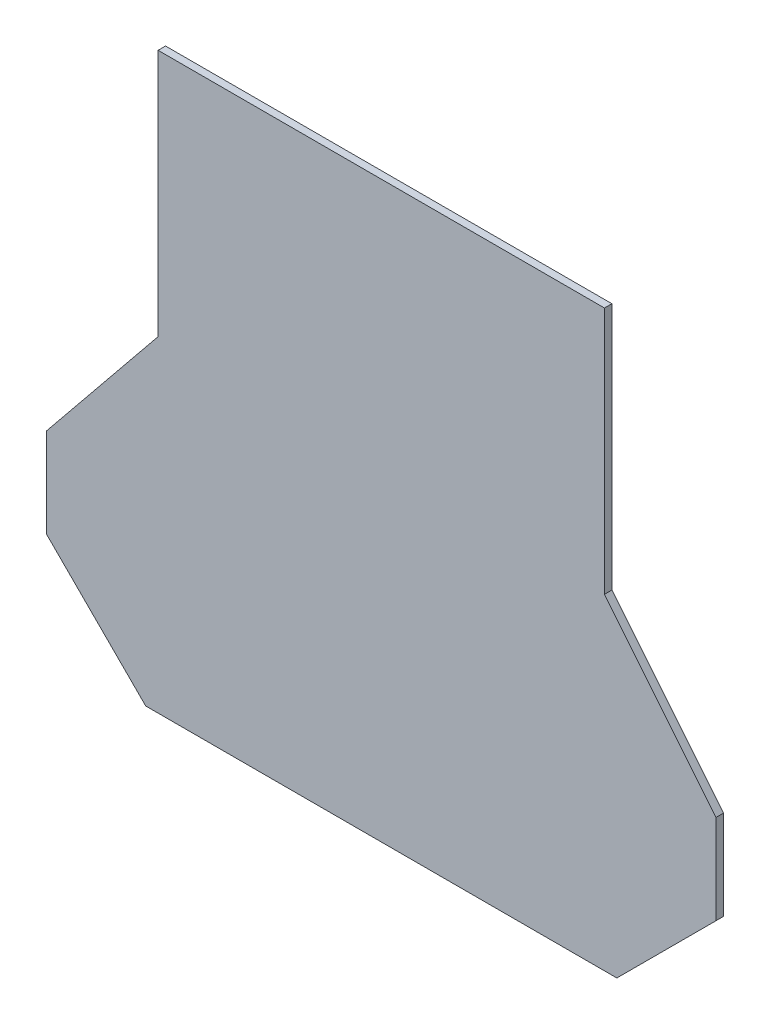
ISO-10303-21;
HEADER;
FILE_DESCRIPTION(('STEP AP214'),'2;1');
FILE_NAME('part.step','',(''),(''),'','','');
FILE_SCHEMA(('AUTOMOTIVE_DESIGN { 1 0 10303 214 1 1 1 1 }'));
ENDSEC;
DATA;
#1=APPLICATION_CONTEXT('core data for automotive mechanical design processes');
#2=APPLICATION_PROTOCOL_DEFINITION('international standard','automotive_design',2000,#1);
#3=PRODUCT_CONTEXT('',#1,'mechanical');
#4=PRODUCT('Part','Part','',(#3));
#5=PRODUCT_RELATED_PRODUCT_CATEGORY('part','',(#4));
#6=PRODUCT_DEFINITION_FORMATION('','',#4);
#7=PRODUCT_DEFINITION_CONTEXT('part definition',#1,'design');
#8=PRODUCT_DEFINITION('design','',#6,#7);
#9=PRODUCT_DEFINITION_SHAPE('','',#8);
#10=(LENGTH_UNIT() NAMED_UNIT(*) SI_UNIT(.MILLI.,.METRE.));
#11=(NAMED_UNIT(*) PLANE_ANGLE_UNIT() SI_UNIT($,.RADIAN.));
#12=(NAMED_UNIT(*) SI_UNIT($,.STERADIAN.) SOLID_ANGLE_UNIT());
#13=UNCERTAINTY_MEASURE_WITH_UNIT(LENGTH_MEASURE(1.E-05),#10,'distance_accuracy_value','');
#14=(GEOMETRIC_REPRESENTATION_CONTEXT(3) GLOBAL_UNCERTAINTY_ASSIGNED_CONTEXT((#13)) GLOBAL_UNIT_ASSIGNED_CONTEXT((#10,
#11,#12)) REPRESENTATION_CONTEXT('',''));
#15=CARTESIAN_POINT('',(0.,0.,0.));
#16=DIRECTION('',(0.,0.,1.));
#17=DIRECTION('',(1.,0.,0.));
#18=AXIS2_PLACEMENT_3D('',#15,#16,#17);
#19=CARTESIAN_POINT('',(-64.126687352412,190.152785153909,3.));
#20=DIRECTION('',(1.,0.,0.));
#21=DIRECTION('',(0.,0.,-1.));
#22=AXIS2_PLACEMENT_3D('',#19,#20,#21);
#23=PLANE('',#22);
#24=DIRECTION('',(0.,-1.,0.));
#25=VECTOR('',#24,1.);
#26=CARTESIAN_POINT('',(-64.126687352412,190.152785153909,0.));
#27=LINE('',#26,#25);
#28=CARTESIAN_POINT('',(-64.126687352412,190.152785153909,0.));
#29=VERTEX_POINT('',#28);
#30=CARTESIAN_POINT('',(-64.126687352412,90.1527851539094,0.));
#31=VERTEX_POINT('',#30);
#32=EDGE_CURVE('E137',#29,#31,#27,.T.);
#33=ORIENTED_EDGE('',*,*,#32,.T.);
#34=DIRECTION('',(0.,0.,-1.));
#35=VECTOR('',#34,1.);
#36=CARTESIAN_POINT('',(-64.126687352412,90.1527851539094,3.));
#37=LINE('',#36,#35);
#38=CARTESIAN_POINT('',(-64.126687352412,90.1527851539094,3.));
#39=VERTEX_POINT('',#38);
#40=EDGE_CURVE('E119',#39,#31,#37,.T.);
#41=ORIENTED_EDGE('',*,*,#40,.F.);
#42=DIRECTION('',(0.,-1.,0.));
#43=VECTOR('',#42,1.);
#44=CARTESIAN_POINT('',(-64.126687352412,190.152785153909,3.));
#45=LINE('',#44,#43);
#46=CARTESIAN_POINT('',(-64.126687352412,190.152785153909,3.));
#47=VERTEX_POINT('',#46);
#48=EDGE_CURVE('E125',#47,#39,#45,.T.);
#49=ORIENTED_EDGE('',*,*,#48,.F.);
#50=DIRECTION('',(0.,0.,-1.));
#51=VECTOR('',#50,1.);
#52=CARTESIAN_POINT('',(-64.126687352412,190.152785153909,3.));
#53=LINE('',#52,#51);
#54=EDGE_CURVE('E190',#47,#29,#53,.T.);
#55=ORIENTED_EDGE('',*,*,#54,.T.);
#56=EDGE_LOOP('',(#33,#41,#49,#55));
#57=FACE_BOUND('',#56,.T.);
#58=ADVANCED_FACE('F35',(#57),#23,.F.);
#59=CARTESIAN_POINT('',(-64.126687352412,90.1527851539094,3.));
#60=DIRECTION('',(0.776321195075407,-0.630337530277781,0.));
#61=DIRECTION('',(0.630337530277781,0.776321195075407,0.));
#62=AXIS2_PLACEMENT_3D('',#59,#60,#61);
#63=PLANE('',#62);
#64=DIRECTION('',(-0.630337530277781,-0.776321195075407,0.));
#65=VECTOR('',#64,1.);
#66=CARTESIAN_POINT('',(-64.126687352412,90.1527851539094,0.));
#67=LINE('',#66,#65);
#68=CARTESIAN_POINT('',(-109.126687352416,34.7309641447728,0.));
#69=VERTEX_POINT('',#68);
#70=EDGE_CURVE('E182',#31,#69,#67,.T.);
#71=ORIENTED_EDGE('',*,*,#70,.T.);
#72=DIRECTION('',(0.,0.,-1.));
#73=VECTOR('',#72,1.);
#74=CARTESIAN_POINT('',(-109.126687352416,34.7309641447728,3.));
#75=LINE('',#74,#73);
#76=CARTESIAN_POINT('',(-109.126687352416,34.7309641447728,3.));
#77=VERTEX_POINT('',#76);
#78=EDGE_CURVE('E122',#77,#69,#75,.T.);
#79=ORIENTED_EDGE('',*,*,#78,.F.);
#80=DIRECTION('',(-0.630337530277781,-0.776321195075407,0.));
#81=VECTOR('',#80,1.);
#82=CARTESIAN_POINT('',(-64.126687352412,90.1527851539094,3.));
#83=LINE('',#82,#81);
#84=EDGE_CURVE('E115',#39,#77,#83,.T.);
#85=ORIENTED_EDGE('',*,*,#84,.F.);
#86=ORIENTED_EDGE('',*,*,#40,.T.);
#87=EDGE_LOOP('',(#71,#79,#85,#86));
#88=FACE_BOUND('',#87,.T.);
#89=ADVANCED_FACE('F117',(#88),#63,.F.);
#90=CARTESIAN_POINT('',(-109.126687352416,34.7309641447728,3.));
#91=DIRECTION('',(1.,0.,0.));
#92=DIRECTION('',(0.,0.,-1.));
#93=AXIS2_PLACEMENT_3D('',#90,#91,#92);
#94=PLANE('',#93);
#95=DIRECTION('',(0.,-1.,0.));
#96=VECTOR('',#95,1.);
#97=CARTESIAN_POINT('',(-109.126687352416,34.7309641447728,0.));
#98=LINE('',#97,#96);
#99=CARTESIAN_POINT('',(-109.126687352416,-1.34721484608986,0.));
#100=VERTEX_POINT('',#99);
#101=EDGE_CURVE('E178',#69,#100,#98,.T.);
#102=ORIENTED_EDGE('',*,*,#101,.T.);
#103=DIRECTION('',(0.,0.,1.));
#104=VECTOR('',#103,1.);
#105=CARTESIAN_POINT('',(-109.126687352416,-1.34721484608987,3.));
#106=LINE('',#105,#104);
#107=CARTESIAN_POINT('',(-109.126687352416,-1.34721484608986,3.));
#108=VERTEX_POINT('',#107);
#109=EDGE_CURVE('E11',#100,#108,#106,.T.);
#110=ORIENTED_EDGE('',*,*,#109,.T.);
#111=DIRECTION('',(0.,-1.,0.));
#112=VECTOR('',#111,1.);
#113=CARTESIAN_POINT('',(-109.126687352416,34.7309641447728,3.));
#114=LINE('',#113,#112);
#115=EDGE_CURVE('E124',#77,#108,#114,.T.);
#116=ORIENTED_EDGE('',*,*,#115,.F.);
#117=ORIENTED_EDGE('',*,*,#78,.T.);
#118=EDGE_LOOP('',(#102,#110,#116,#117));
#119=FACE_BOUND('',#118,.T.);
#120=ADVANCED_FACE('F214',(#119),#94,.F.);
#121=CARTESIAN_POINT('',(-109.126687352416,-41.3472148460901,3.));
#122=DIRECTION('',(0.,1.,0.));
#123=DIRECTION('',(0.,0.,1.));
#124=AXIS2_PLACEMENT_3D('',#121,#122,#123);
#125=PLANE('',#124);
#126=DIRECTION('',(1.,0.,0.));
#127=VECTOR('',#126,1.);
#128=CARTESIAN_POINT('',(-109.126687352416,-41.3472148460901,0.));
#129=LINE('',#128,#127);
#130=CARTESIAN_POINT('',(-69.1266873524159,-41.3472148460901,0.));
#131=VERTEX_POINT('',#130);
#132=CARTESIAN_POINT('',(120.873312647584,-41.3472148460901,0.));
#133=VERTEX_POINT('',#132);
#134=EDGE_CURVE('E173',#131,#133,#129,.T.);
#135=ORIENTED_EDGE('',*,*,#134,.T.);
#136=DIRECTION('',(0.,0.,1.));
#137=VECTOR('',#136,1.);
#138=CARTESIAN_POINT('',(120.873312647584,-41.3472148460901,3.));
#139=LINE('',#138,#137);
#140=CARTESIAN_POINT('',(120.873312647584,-41.3472148460901,3.));
#141=VERTEX_POINT('',#140);
#142=EDGE_CURVE('E57',#133,#141,#139,.T.);
#143=ORIENTED_EDGE('',*,*,#142,.T.);
#144=DIRECTION('',(1.,0.,0.));
#145=VECTOR('',#144,1.);
#146=CARTESIAN_POINT('',(-109.126687352416,-41.3472148460901,3.));
#147=LINE('',#146,#145);
#148=CARTESIAN_POINT('',(-69.1266873524159,-41.3472148460901,3.));
#149=VERTEX_POINT('',#148);
#150=EDGE_CURVE('E159',#149,#141,#147,.T.);
#151=ORIENTED_EDGE('',*,*,#150,.F.);
#152=DIRECTION('',(0.,0.,-1.));
#153=VECTOR('',#152,1.);
#154=CARTESIAN_POINT('',(-69.1266873524159,-41.3472148460901,3.));
#155=LINE('',#154,#153);
#156=EDGE_CURVE('E150',#149,#131,#155,.T.);
#157=ORIENTED_EDGE('',*,*,#156,.T.);
#158=EDGE_LOOP('',(#135,#143,#151,#157));
#159=FACE_BOUND('',#158,.T.);
#160=ADVANCED_FACE('F176',(#159),#125,.F.);
#161=CARTESIAN_POINT('',(160.873312647584,34.7309641447728,3.));
#162=DIRECTION('',(-1.,0.,0.));
#163=DIRECTION('',(0.,0.,1.));
#164=AXIS2_PLACEMENT_3D('',#161,#162,#163);
#165=PLANE('',#164);
#166=DIRECTION('',(0.,1.,0.));
#167=VECTOR('',#166,1.);
#168=CARTESIAN_POINT('',(160.873312647584,34.7309641447728,3.));
#169=LINE('',#168,#167);
#170=CARTESIAN_POINT('',(160.873312647584,-1.34721484609004,3.));
#171=VERTEX_POINT('',#170);
#172=CARTESIAN_POINT('',(160.873312647584,34.7309641447728,3.));
#173=VERTEX_POINT('',#172);
#174=EDGE_CURVE('E157',#171,#173,#169,.T.);
#175=ORIENTED_EDGE('',*,*,#174,.F.);
#176=DIRECTION('',(0.,0.,-1.));
#177=VECTOR('',#176,1.);
#178=CARTESIAN_POINT('',(160.873312647584,-1.34721484609004,3.));
#179=LINE('',#178,#177);
#180=CARTESIAN_POINT('',(160.873312647584,-1.34721484609004,0.));
#181=VERTEX_POINT('',#180);
#182=EDGE_CURVE('E138',#171,#181,#179,.T.);
#183=ORIENTED_EDGE('',*,*,#182,.T.);
#184=DIRECTION('',(0.,1.,0.));
#185=VECTOR('',#184,1.);
#186=CARTESIAN_POINT('',(160.873312647584,34.7309641447728,0.));
#187=LINE('',#186,#185);
#188=CARTESIAN_POINT('',(160.873312647584,34.7309641447728,0.));
#189=VERTEX_POINT('',#188);
#190=EDGE_CURVE('E175',#181,#189,#187,.T.);
#191=ORIENTED_EDGE('',*,*,#190,.T.);
#192=DIRECTION('',(0.,0.,-1.));
#193=VECTOR('',#192,1.);
#194=CARTESIAN_POINT('',(160.873312647584,34.7309641447728,3.));
#195=LINE('',#194,#193);
#196=EDGE_CURVE('E143',#173,#189,#195,.T.);
#197=ORIENTED_EDGE('',*,*,#196,.F.);
#198=EDGE_LOOP('',(#175,#183,#191,#197));
#199=FACE_BOUND('',#198,.T.);
#200=ADVANCED_FACE('F163',(#199),#165,.F.);
#201=CARTESIAN_POINT('',(115.873312647588,90.1527851539094,3.));
#202=DIRECTION('',(-0.776321195075462,-0.630337530277713,0.));
#203=DIRECTION('',(0.630337530277713,-0.776321195075462,0.));
#204=AXIS2_PLACEMENT_3D('',#201,#202,#203);
#205=PLANE('',#204);
#206=DIRECTION('',(-0.630337530277713,0.776321195075462,0.));
#207=VECTOR('',#206,1.);
#208=CARTESIAN_POINT('',(115.873312647588,90.1527851539094,0.));
#209=LINE('',#208,#207);
#210=CARTESIAN_POINT('',(115.873312647588,90.1527851539094,0.));
#211=VERTEX_POINT('',#210);
#212=EDGE_CURVE('E180',#189,#211,#209,.T.);
#213=ORIENTED_EDGE('',*,*,#212,.T.);
#214=DIRECTION('',(0.,0.,-1.));
#215=VECTOR('',#214,1.);
#216=CARTESIAN_POINT('',(115.873312647588,90.1527851539094,3.));
#217=LINE('',#216,#215);
#218=CARTESIAN_POINT('',(115.873312647588,90.1527851539094,3.));
#219=VERTEX_POINT('',#218);
#220=EDGE_CURVE('E195',#219,#211,#217,.T.);
#221=ORIENTED_EDGE('',*,*,#220,.F.);
#222=DIRECTION('',(-0.630337530277713,0.776321195075462,0.));
#223=VECTOR('',#222,1.);
#224=CARTESIAN_POINT('',(115.873312647588,90.1527851539094,3.));
#225=LINE('',#224,#223);
#226=EDGE_CURVE('E167',#173,#219,#225,.T.);
#227=ORIENTED_EDGE('',*,*,#226,.F.);
#228=ORIENTED_EDGE('',*,*,#196,.T.);
#229=EDGE_LOOP('',(#213,#221,#227,#228));
#230=FACE_BOUND('',#229,.T.);
#231=ADVANCED_FACE('F198',(#230),#205,.F.);
#232=CARTESIAN_POINT('',(115.873312647588,190.152785153909,3.));
#233=DIRECTION('',(-1.,0.,0.));
#234=DIRECTION('',(0.,-1.,0.));
#235=AXIS2_PLACEMENT_3D('',#232,#233,#234);
#236=PLANE('',#235);
#237=DIRECTION('',(0.,1.,0.));
#238=VECTOR('',#237,1.);
#239=CARTESIAN_POINT('',(115.873312647588,190.152785153909,0.));
#240=LINE('',#239,#238);
#241=CARTESIAN_POINT('',(115.873312647588,190.152785153909,0.));
#242=VERTEX_POINT('',#241);
#243=EDGE_CURVE('E187',#211,#242,#240,.T.);
#244=ORIENTED_EDGE('',*,*,#243,.T.);
#245=DIRECTION('',(0.,0.,-1.));
#246=VECTOR('',#245,1.);
#247=CARTESIAN_POINT('',(115.873312647588,190.152785153909,3.));
#248=LINE('',#247,#246);
#249=CARTESIAN_POINT('',(115.873312647588,190.152785153909,3.));
#250=VERTEX_POINT('',#249);
#251=EDGE_CURVE('E192',#250,#242,#248,.T.);
#252=ORIENTED_EDGE('',*,*,#251,.F.);
#253=DIRECTION('',(0.,1.,0.));
#254=VECTOR('',#253,1.);
#255=CARTESIAN_POINT('',(115.873312647588,190.152785153909,3.));
#256=LINE('',#255,#254);
#257=EDGE_CURVE('E208',#219,#250,#256,.T.);
#258=ORIENTED_EDGE('',*,*,#257,.F.);
#259=ORIENTED_EDGE('',*,*,#220,.T.);
#260=EDGE_LOOP('',(#244,#252,#258,#259));
#261=FACE_BOUND('',#260,.T.);
#262=ADVANCED_FACE('F204',(#261),#236,.F.);
#263=CARTESIAN_POINT('',(-64.126687352412,190.152785153909,3.));
#264=DIRECTION('',(0.,-1.,0.));
#265=DIRECTION('',(0.,0.,-1.));
#266=AXIS2_PLACEMENT_3D('',#263,#264,#265);
#267=PLANE('',#266);
#268=DIRECTION('',(-1.,0.,0.));
#269=VECTOR('',#268,1.);
#270=CARTESIAN_POINT('',(-64.126687352412,190.152785153909,0.));
#271=LINE('',#270,#269);
#272=EDGE_CURVE('E134',#242,#29,#271,.T.);
#273=ORIENTED_EDGE('',*,*,#272,.T.);
#274=ORIENTED_EDGE('',*,*,#54,.F.);
#275=DIRECTION('',(-1.,0.,0.));
#276=VECTOR('',#275,1.);
#277=CARTESIAN_POINT('',(-64.126687352412,190.152785153909,3.));
#278=LINE('',#277,#276);
#279=EDGE_CURVE('E130',#250,#47,#278,.T.);
#280=ORIENTED_EDGE('',*,*,#279,.F.);
#281=ORIENTED_EDGE('',*,*,#251,.T.);
#282=EDGE_LOOP('',(#273,#274,#280,#281));
#283=FACE_BOUND('',#282,.T.);
#284=ADVANCED_FACE('F207',(#283),#267,.F.);
#285=CARTESIAN_POINT('',(0.,0.,3.));
#286=DIRECTION('',(0.,0.,1.));
#287=DIRECTION('',(1.,0.,0.));
#288=AXIS2_PLACEMENT_3D('',#285,#286,#287);
#289=PLANE('',#288);
#290=ORIENTED_EDGE('',*,*,#150,.T.);
#291=DIRECTION('',(-0.707106781186548,-0.707106781186547,0.));
#292=VECTOR('',#291,1.);
#293=CARTESIAN_POINT('',(81.1102637468368,-81.110263746837,3.));
#294=LINE('',#293,#292);
#295=EDGE_CURVE('E44',#141,#171,#294,.F.);
#296=ORIENTED_EDGE('',*,*,#295,.T.);
#297=ORIENTED_EDGE('',*,*,#174,.T.);
#298=ORIENTED_EDGE('',*,*,#226,.T.);
#299=ORIENTED_EDGE('',*,*,#257,.T.);
#300=ORIENTED_EDGE('',*,*,#279,.T.);
#301=ORIENTED_EDGE('',*,*,#48,.T.);
#302=ORIENTED_EDGE('',*,*,#84,.T.);
#303=ORIENTED_EDGE('',*,*,#115,.T.);
#304=DIRECTION('',(-0.707106781186547,0.707106781186549,0.));
#305=VECTOR('',#304,1.);
#306=CARTESIAN_POINT('',(-55.2369510992531,-55.2369510992529,3.));
#307=LINE('',#306,#305);
#308=EDGE_CURVE('E154',#108,#149,#307,.F.);
#309=ORIENTED_EDGE('',*,*,#308,.T.);
#310=EDGE_LOOP('',(#290,#296,#297,#298,#299,#300,#301,#302,#303,#309));
#311=FACE_BOUND('',#310,.T.);
#312=ADVANCED_FACE('F128',(#311),#289,.T.);
#313=CARTESIAN_POINT('',(0.,0.,0.));
#314=DIRECTION('',(0.,0.,1.));
#315=DIRECTION('',(1.,0.,0.));
#316=AXIS2_PLACEMENT_3D('',#313,#314,#315);
#317=PLANE('',#316);
#318=ORIENTED_EDGE('',*,*,#190,.F.);
#319=DIRECTION('',(0.707106781186548,0.707106781186547,0.));
#320=VECTOR('',#319,1.);
#321=CARTESIAN_POINT('',(160.873312647584,-1.34721484609004,0.));
#322=LINE('',#321,#320);
#323=EDGE_CURVE('E148',#181,#133,#322,.F.);
#324=ORIENTED_EDGE('',*,*,#323,.T.);
#325=ORIENTED_EDGE('',*,*,#134,.F.);
#326=DIRECTION('',(0.707106781186547,-0.707106781186549,0.));
#327=VECTOR('',#326,1.);
#328=CARTESIAN_POINT('',(-69.1266873524159,-41.3472148460901,0.));
#329=LINE('',#328,#327);
#330=EDGE_CURVE('E141',#131,#100,#329,.F.);
#331=ORIENTED_EDGE('',*,*,#330,.T.);
#332=ORIENTED_EDGE('',*,*,#101,.F.);
#333=ORIENTED_EDGE('',*,*,#70,.F.);
#334=ORIENTED_EDGE('',*,*,#32,.F.);
#335=ORIENTED_EDGE('',*,*,#272,.F.);
#336=ORIENTED_EDGE('',*,*,#243,.F.);
#337=ORIENTED_EDGE('',*,*,#212,.F.);
#338=EDGE_LOOP('',(#318,#324,#325,#331,#332,#333,#334,#335,#336,#337));
#339=FACE_BOUND('',#338,.T.);
#340=ADVANCED_FACE('F172',(#339),#317,.F.);
#341=CARTESIAN_POINT('',(160.873312647584,-1.34721484609004,3.));
#342=DIRECTION('',(-0.707106781186547,0.707106781186548,0.));
#343=DIRECTION('',(0.,0.,-1.));
#344=AXIS2_PLACEMENT_3D('',#341,#342,#343);
#345=PLANE('',#344);
#346=ORIENTED_EDGE('',*,*,#295,.F.);
#347=ORIENTED_EDGE('',*,*,#142,.F.);
#348=ORIENTED_EDGE('',*,*,#323,.F.);
#349=ORIENTED_EDGE('',*,*,#182,.F.);
#350=EDGE_LOOP('',(#346,#347,#348,#349));
#351=FACE_BOUND('',#350,.T.);
#352=ADVANCED_FACE('F169',(#351),#345,.F.);
#353=CARTESIAN_POINT('',(-69.1266873524159,-41.3472148460901,3.));
#354=DIRECTION('',(0.707106781186549,0.707106781186547,0.));
#355=DIRECTION('',(0.,0.,-1.));
#356=AXIS2_PLACEMENT_3D('',#353,#354,#355);
#357=PLANE('',#356);
#358=ORIENTED_EDGE('',*,*,#308,.F.);
#359=ORIENTED_EDGE('',*,*,#109,.F.);
#360=ORIENTED_EDGE('',*,*,#330,.F.);
#361=ORIENTED_EDGE('',*,*,#156,.F.);
#362=EDGE_LOOP('',(#358,#359,#360,#361));
#363=FACE_BOUND('',#362,.T.);
#364=ADVANCED_FACE('F38',(#363),#357,.F.);
#365=CLOSED_SHELL('',(#58,#89,#120,#160,#200,#231,#262,#284,#312,#340,#352,#364));
#366=MANIFOLD_SOLID_BREP('B2',#365);
#367=ADVANCED_BREP_SHAPE_REPRESENTATION('',(#18,#366),#14);
#368=SHAPE_DEFINITION_REPRESENTATION(#9,#367);
ENDSEC;
END-ISO-10303-21;
